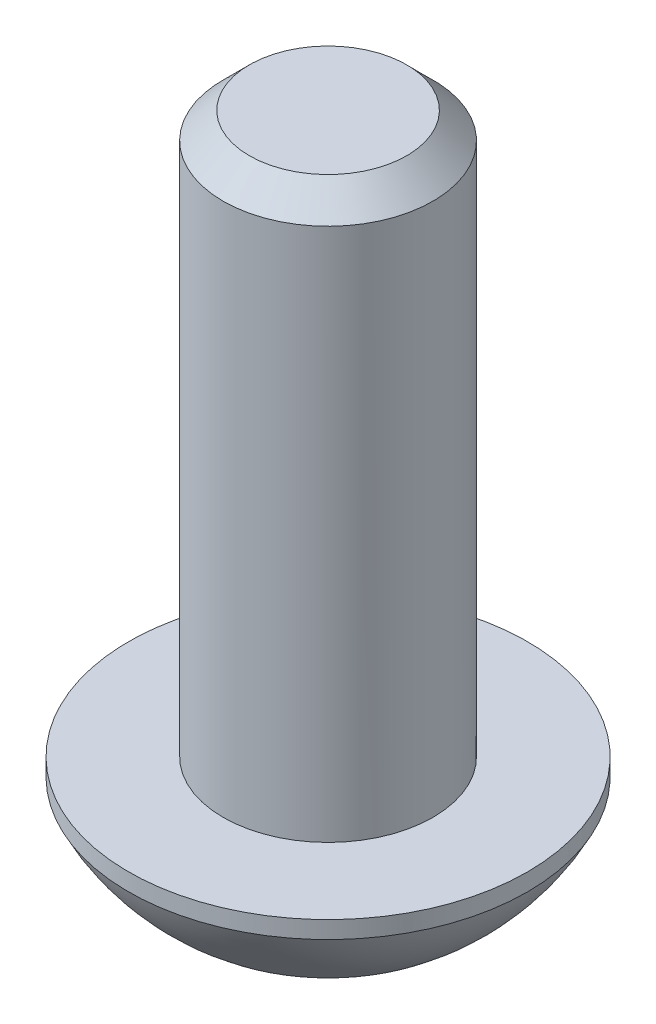
ISO-10303-21;
HEADER;
FILE_DESCRIPTION(('STEP AP214'),'2;1');
FILE_NAME('part.step','',(''),(''),'','','');
FILE_SCHEMA(('AUTOMOTIVE_DESIGN { 1 0 10303 214 1 1 1 1 }'));
ENDSEC;
DATA;
#1=APPLICATION_CONTEXT('core data for automotive mechanical design processes');
#2=APPLICATION_PROTOCOL_DEFINITION('international standard','automotive_design',2000,#1);
#3=PRODUCT_CONTEXT('',#1,'mechanical');
#4=PRODUCT('Part','Part','',(#3));
#5=PRODUCT_RELATED_PRODUCT_CATEGORY('part','',(#4));
#6=PRODUCT_DEFINITION_FORMATION('','',#4);
#7=PRODUCT_DEFINITION_CONTEXT('part definition',#1,'design');
#8=PRODUCT_DEFINITION('design','',#6,#7);
#9=PRODUCT_DEFINITION_SHAPE('','',#8);
#10=(LENGTH_UNIT() NAMED_UNIT(*) SI_UNIT(.MILLI.,.METRE.));
#11=(NAMED_UNIT(*) PLANE_ANGLE_UNIT() SI_UNIT($,.RADIAN.));
#12=(NAMED_UNIT(*) SI_UNIT($,.STERADIAN.) SOLID_ANGLE_UNIT());
#13=UNCERTAINTY_MEASURE_WITH_UNIT(LENGTH_MEASURE(1.E-05),#10,'distance_accuracy_value','');
#14=(GEOMETRIC_REPRESENTATION_CONTEXT(3) GLOBAL_UNCERTAINTY_ASSIGNED_CONTEXT((#13)) GLOBAL_UNIT_ASSIGNED_CONTEXT((#10,
#11,#12)) REPRESENTATION_CONTEXT('',''));
#15=CARTESIAN_POINT('',(0.,0.,0.));
#16=DIRECTION('',(0.,0.,1.));
#17=DIRECTION('',(1.,0.,0.));
#18=AXIS2_PLACEMENT_3D('',#15,#16,#17);
#19=CARTESIAN_POINT('',(12.5,31.750000124,0.));
#20=DIRECTION('',(0.,-1.,0.));
#21=DIRECTION('',(1.,0.,0.));
#22=AXIS2_PLACEMENT_3D('',#19,#20,#21);
#23=CONICAL_SURFACE('',#22,1.15470053837925,0.78539816339745);
#24=CARTESIAN_POINT('',(13.5,31.750000124,-0.577350269189623));
#25=CARTESIAN_POINT('',(13.5,31.9035249805768,-0.270300556036056));
#26=CARTESIAN_POINT('',(13.5,31.9046979425669,-0.00233230374689804));
#27=CARTESIAN_POINT('',(13.5,31.9058707863537,0.265608944482054));
#28=CARTESIAN_POINT('',(13.5,31.750000124,0.57735026918963));
#29=B_SPLINE_CURVE_WITH_KNOTS('',2,(#24,#25,#26,#27,#28),.UNSPECIFIED.,.F.,.F.,(3,2,3),(0.,0.5,
1.),.UNSPECIFIED.);
#30=CARTESIAN_POINT('',(13.5,31.750000124,-0.577350269189622));
#31=VERTEX_POINT('',#30);
#32=CARTESIAN_POINT('',(13.5,31.750000124,0.57735026918963));
#33=VERTEX_POINT('',#32);
#34=EDGE_CURVE('E379',#31,#33,#29,.T.);
#35=ORIENTED_EDGE('',*,*,#34,.F.);
#36=CARTESIAN_POINT('',(12.5,31.750000124,0.));
#37=DIRECTION('',(0.,-1.,0.));
#38=DIRECTION('',(1.,0.,0.));
#39=AXIS2_PLACEMENT_3D('',#36,#37,#38);
#40=CIRCLE('',#39,1.15470053837925);
#41=EDGE_CURVE('E281',#31,#33,#40,.T.);
#42=ORIENTED_EDGE('',*,*,#41,.T.);
#43=EDGE_LOOP('',(#35,#42));
#44=FACE_BOUND('',#43,.T.);
#45=ADVANCED_FACE('F16',(#44),#23,.F.);
#46=CARTESIAN_POINT('',(12.5,31.750000124,0.));
#47=DIRECTION('',(0.,-1.,0.));
#48=DIRECTION('',(1.,0.,0.));
#49=AXIS2_PLACEMENT_3D('',#46,#47,#48);
#50=CYLINDRICAL_SURFACE('',#49,2.85);
#51=CARTESIAN_POINT('',(12.5,33.400000124,0.));
#52=DIRECTION('',(0.,-1.,0.));
#53=DIRECTION('',(1.,0.,0.));
#54=AXIS2_PLACEMENT_3D('',#51,#52,#53);
#55=CIRCLE('',#54,2.85);
#56=CARTESIAN_POINT('',(15.35,33.400000124,0.));
#57=VERTEX_POINT('',#56);
#58=EDGE_CURVE('E305',#57,#57,#55,.T.);
#59=ORIENTED_EDGE('',*,*,#58,.T.);
#60=EDGE_LOOP('',(#59));
#61=FACE_BOUND('',#60,.T.);
#62=CARTESIAN_POINT('',(12.5,33.152500124,0.));
#63=DIRECTION('',(0.,-1.,0.));
#64=DIRECTION('',(1.,0.,0.));
#65=AXIS2_PLACEMENT_3D('',#62,#63,#64);
#66=CIRCLE('',#65,2.85);
#67=CARTESIAN_POINT('',(15.35,33.152500124,0.));
#68=VERTEX_POINT('',#67);
#69=EDGE_CURVE('E11',#68,#68,#66,.T.);
#70=ORIENTED_EDGE('',*,*,#69,.F.);
#71=EDGE_LOOP('',(#70));
#72=FACE_BOUND('',#71,.T.);
#73=ADVANCED_FACE('F18',(#61,#72),#50,.T.);
#74=CARTESIAN_POINT('',(12.5,34.5448330117005,0.));
#75=DIRECTION('',(1.,0.,0.));
#76=DIRECTION('',(0.,0.,-1.));
#77=AXIS2_PLACEMENT_3D('',#74,#75,#76);
#78=SPHERICAL_SURFACE('',#77,3.17192226735973);
#79=CARTESIAN_POINT('',(12.5,34.5448330117005,0.));
#80=DIRECTION('',(0.,-1.,0.));
#81=DIRECTION('',(1.,0.,0.));
#82=AXIS2_PLACEMENT_3D('',#79,#80,#81);
#83=SPHERICAL_SURFACE('',#82,3.17192226735973);
#84=ORIENTED_EDGE('',*,*,#69,.T.);
#85=EDGE_LOOP('',(#84));
#86=FACE_BOUND('',#85,.T.);
#87=CARTESIAN_POINT('',(12.5,31.750000124,0.));
#88=DIRECTION('',(0.,-1.,0.));
#89=DIRECTION('',(1.,0.,0.));
#90=AXIS2_PLACEMENT_3D('',#87,#88,#89);
#91=CIRCLE('',#90,1.5);
#92=CARTESIAN_POINT('',(14.,31.750000124,0.));
#93=VERTEX_POINT('',#92);
#94=EDGE_CURVE('E290',#93,#93,#91,.T.);
#95=ORIENTED_EDGE('',*,*,#94,.F.);
#96=EDGE_LOOP('',(#95));
#97=FACE_BOUND('',#96,.T.);
#98=ADVANCED_FACE('F353',(#86,#97),#83,.T.);
#99=CARTESIAN_POINT('',(12.5,41.400000124,0.));
#100=DIRECTION('',(0.,-1.,0.));
#101=DIRECTION('',(0.,0.,-1.));
#102=AXIS2_PLACEMENT_3D('',#99,#100,#101);
#103=CONICAL_SURFACE('',#102,1.125,0.785398163397446);
#104=CARTESIAN_POINT('',(12.5,41.400000124,0.));
#105=DIRECTION('',(0.,1.,0.));
#106=DIRECTION('',(0.,0.,1.));
#107=AXIS2_PLACEMENT_3D('',#104,#105,#106);
#108=CIRCLE('',#107,1.125);
#109=CARTESIAN_POINT('',(12.5,41.400000124,1.125));
#110=VERTEX_POINT('',#109);
#111=EDGE_CURVE('E289',#110,#110,#108,.T.);
#112=ORIENTED_EDGE('',*,*,#111,.F.);
#113=EDGE_LOOP('',(#112));
#114=FACE_BOUND('',#113,.T.);
#115=CARTESIAN_POINT('',(12.5,41.025000124,0.));
#116=DIRECTION('',(0.,-1.,0.));
#117=DIRECTION('',(0.,0.,1.));
#118=AXIS2_PLACEMENT_3D('',#115,#116,#117);
#119=CIRCLE('',#118,1.5);
#120=CARTESIAN_POINT('',(12.5,41.025000124,1.5));
#121=VERTEX_POINT('',#120);
#122=EDGE_CURVE('E28',#121,#121,#119,.T.);
#123=ORIENTED_EDGE('',*,*,#122,.F.);
#124=EDGE_LOOP('',(#123));
#125=FACE_BOUND('',#124,.T.);
#126=ADVANCED_FACE('F351',(#114,#125),#103,.T.);
#127=CARTESIAN_POINT('',(12.5,41.400000124,0.));
#128=DIRECTION('',(0.,1.,0.));
#129=DIRECTION('',(0.,0.,1.));
#130=AXIS2_PLACEMENT_3D('',#127,#128,#129);
#131=CYLINDRICAL_SURFACE('',#130,1.5);
#132=CARTESIAN_POINT('',(12.5,33.400000124,0.));
#133=DIRECTION('',(0.,1.,0.));
#134=DIRECTION('',(1.,0.,0.));
#135=AXIS2_PLACEMENT_3D('',#132,#133,#134);
#136=CIRCLE('',#135,1.5);
#137=CARTESIAN_POINT('',(14.,33.400000124,0.));
#138=VERTEX_POINT('',#137);
#139=EDGE_CURVE('E365',#138,#138,#136,.T.);
#140=ORIENTED_EDGE('',*,*,#139,.T.);
#141=EDGE_LOOP('',(#140));
#142=FACE_BOUND('',#141,.T.);
#143=ORIENTED_EDGE('',*,*,#122,.T.);
#144=EDGE_LOOP('',(#143));
#145=FACE_BOUND('',#144,.T.);
#146=ADVANCED_FACE('F228',(#142,#145),#131,.T.);
#147=CARTESIAN_POINT('',(12.5,41.400000124,-1.5));
#148=DIRECTION('',(0.,1.,0.));
#149=DIRECTION('',(0.,0.,-1.));
#150=AXIS2_PLACEMENT_3D('',#147,#148,#149);
#151=PLANE('',#150);
#152=ORIENTED_EDGE('',*,*,#111,.T.);
#153=EDGE_LOOP('',(#152));
#154=FACE_BOUND('',#153,.T.);
#155=ADVANCED_FACE('F272',(#154),#151,.T.);
#156=CARTESIAN_POINT('',(12.5,31.750000124,-1.5));
#157=DIRECTION('',(0.,1.,0.));
#158=DIRECTION('',(1.,0.,0.));
#159=AXIS2_PLACEMENT_3D('',#156,#157,#158);
#160=PLANE('',#159);
#161=CARTESIAN_POINT('',(12.5,31.750000124,0.));
#162=DIRECTION('',(0.,-1.,0.));
#163=DIRECTION('',(1.,0.,0.));
#164=AXIS2_PLACEMENT_3D('',#161,#162,#163);
#165=CIRCLE('',#164,1.15470053837925);
#166=CARTESIAN_POINT('',(11.5,31.750000124,0.57735026918963));
#167=VERTEX_POINT('',#166);
#168=CARTESIAN_POINT('',(11.5,31.750000124,-0.577350269189622));
#169=VERTEX_POINT('',#168);
#170=EDGE_CURVE('E201',#167,#169,#165,.T.);
#171=ORIENTED_EDGE('',*,*,#170,.F.);
#172=CARTESIAN_POINT('',(12.5,31.750000124,0.));
#173=DIRECTION('',(0.,-1.,0.));
#174=DIRECTION('',(1.,0.,0.));
#175=AXIS2_PLACEMENT_3D('',#172,#173,#174);
#176=CIRCLE('',#175,1.15470053837925);
#177=CARTESIAN_POINT('',(12.5,31.750000124,1.15470053837926));
#178=VERTEX_POINT('',#177);
#179=EDGE_CURVE('E244',#178,#167,#176,.T.);
#180=ORIENTED_EDGE('',*,*,#179,.F.);
#181=CARTESIAN_POINT('',(12.5,31.750000124,0.));
#182=DIRECTION('',(0.,-1.,0.));
#183=DIRECTION('',(1.,0.,0.));
#184=AXIS2_PLACEMENT_3D('',#181,#182,#183);
#185=CIRCLE('',#184,1.15470053837925);
#186=EDGE_CURVE('E302',#33,#178,#185,.T.);
#187=ORIENTED_EDGE('',*,*,#186,.F.);
#188=ORIENTED_EDGE('',*,*,#41,.F.);
#189=CARTESIAN_POINT('',(12.5,31.750000124,0.));
#190=DIRECTION('',(0.,-1.,0.));
#191=DIRECTION('',(1.,0.,0.));
#192=AXIS2_PLACEMENT_3D('',#189,#190,#191);
#193=CIRCLE('',#192,1.15470053837925);
#194=CARTESIAN_POINT('',(12.5,31.750000124,-1.15470053837925));
#195=VERTEX_POINT('',#194);
#196=EDGE_CURVE('E202',#195,#31,#193,.T.);
#197=ORIENTED_EDGE('',*,*,#196,.F.);
#198=CARTESIAN_POINT('',(12.5,31.750000124,0.));
#199=DIRECTION('',(0.,-1.,0.));
#200=DIRECTION('',(1.,0.,0.));
#201=AXIS2_PLACEMENT_3D('',#198,#199,#200);
#202=CIRCLE('',#201,1.15470053837925);
#203=EDGE_CURVE('E186',#169,#195,#202,.T.);
#204=ORIENTED_EDGE('',*,*,#203,.F.);
#205=EDGE_LOOP('',(#171,#180,#187,#188,#197,#204));
#206=FACE_BOUND('',#205,.T.);
#207=ORIENTED_EDGE('',*,*,#94,.T.);
#208=EDGE_LOOP('',(#207));
#209=FACE_BOUND('',#208,.T.);
#210=ADVANCED_FACE('F346',(#206,#209),#160,.F.);
#211=CARTESIAN_POINT('',(12.5,33.400000124,-2.85));
#212=DIRECTION('',(0.,-1.,0.));
#213=DIRECTION('',(0.,0.,-1.));
#214=AXIS2_PLACEMENT_3D('',#211,#212,#213);
#215=PLANE('',#214);
#216=ORIENTED_EDGE('',*,*,#139,.F.);
#217=EDGE_LOOP('',(#216));
#218=FACE_BOUND('',#217,.T.);
#219=ORIENTED_EDGE('',*,*,#58,.F.);
#220=EDGE_LOOP('',(#219));
#221=FACE_BOUND('',#220,.T.);
#222=ADVANCED_FACE('F343',(#218,#221),#215,.F.);
#223=CARTESIAN_POINT('',(12.5,31.750000124,0.));
#224=DIRECTION('',(0.,-1.,0.));
#225=DIRECTION('',(1.,0.,0.));
#226=AXIS2_PLACEMENT_3D('',#223,#224,#225);
#227=CONICAL_SURFACE('',#226,1.15470053837925,0.78539816339745);
#228=ORIENTED_EDGE('',*,*,#186,.T.);
#229=CARTESIAN_POINT('',(13.5,31.750000124,0.57735026918963));
#230=CARTESIAN_POINT('',(13.234077729137,31.9035304186663,0.730880563855873));
#231=CARTESIAN_POINT('',(13.0018404062,31.9046984043185,0.864962844769466));
#232=CARTESIAN_POINT('',(12.769965138002,31.9058645690974,0.998836093281985));
#233=CARTESIAN_POINT('',(12.5,31.750000124,1.15470053837926));
#234=B_SPLINE_CURVE_WITH_KNOTS('',2,(#229,#230,#231,#232,#233),.UNSPECIFIED.,.F.,.F.,(3,2,3),
(0.,0.5,1.),.UNSPECIFIED.);
#235=EDGE_CURVE('E312',#33,#178,#234,.T.);
#236=ORIENTED_EDGE('',*,*,#235,.F.);
#237=EDGE_LOOP('',(#228,#236));
#238=FACE_BOUND('',#237,.T.);
#239=ADVANCED_FACE('F226',(#238),#227,.F.);
#240=CARTESIAN_POINT('',(12.5,31.750000124,0.));
#241=DIRECTION('',(0.,-1.,0.));
#242=DIRECTION('',(1.,0.,0.));
#243=AXIS2_PLACEMENT_3D('',#240,#241,#242);
#244=CONICAL_SURFACE('',#243,1.15470053837925,0.78539816339745);
#245=ORIENTED_EDGE('',*,*,#179,.T.);
#246=CARTESIAN_POINT('',(12.5,31.750000124,1.15470053837926));
#247=CARTESIAN_POINT('',(12.2340777291371,31.9035304186663,1.00117024371303));
#248=CARTESIAN_POINT('',(12.0018404062,31.9046984043185,0.867087962799423));
#249=CARTESIAN_POINT('',(11.7699651380023,31.9058645690974,0.73321471428705));
#250=CARTESIAN_POINT('',(11.5,31.750000124,0.577350269189633));
#251=B_SPLINE_CURVE_WITH_KNOTS('',2,(#246,#247,#248,#249,#250),.UNSPECIFIED.,.F.,.F.,(3,2,3),
(0.,0.5,1.),.UNSPECIFIED.);
#252=EDGE_CURVE('E403',#178,#167,#251,.T.);
#253=ORIENTED_EDGE('',*,*,#252,.F.);
#254=EDGE_LOOP('',(#245,#253));
#255=FACE_BOUND('',#254,.T.);
#256=ADVANCED_FACE('F218',(#255),#244,.F.);
#257=CARTESIAN_POINT('',(12.5,31.750000124,0.));
#258=DIRECTION('',(0.,-1.,0.));
#259=DIRECTION('',(1.,0.,0.));
#260=AXIS2_PLACEMENT_3D('',#257,#258,#259);
#261=CONICAL_SURFACE('',#260,1.15470053837925,0.78539816339745);
#262=ORIENTED_EDGE('',*,*,#170,.T.);
#263=CARTESIAN_POINT('',(11.5,31.750000124,0.57735026918963));
#264=CARTESIAN_POINT('',(11.5,31.9035304186663,0.270289679857131));
#265=CARTESIAN_POINT('',(11.5,31.9046984043185,0.00212511802996607));
#266=CARTESIAN_POINT('',(11.5,31.9058645690974,-0.265621378994729));
#267=CARTESIAN_POINT('',(11.5,31.750000124,-0.577350269189622));
#268=B_SPLINE_CURVE_WITH_KNOTS('',2,(#263,#264,#265,#266,#267),.UNSPECIFIED.,.F.,.F.,(3,2,3),
(0.,0.5,1.),.UNSPECIFIED.);
#269=EDGE_CURVE('E250',#167,#169,#268,.T.);
#270=ORIENTED_EDGE('',*,*,#269,.F.);
#271=EDGE_LOOP('',(#262,#270));
#272=FACE_BOUND('',#271,.T.);
#273=ADVANCED_FACE('F209',(#272),#261,.F.);
#274=CARTESIAN_POINT('',(12.5,31.750000124,0.));
#275=DIRECTION('',(0.,-1.,0.));
#276=DIRECTION('',(1.,0.,0.));
#277=AXIS2_PLACEMENT_3D('',#274,#275,#276);
#278=CONICAL_SURFACE('',#277,1.15470053837925,0.78539816339745);
#279=ORIENTED_EDGE('',*,*,#203,.T.);
#280=CARTESIAN_POINT('',(11.5,31.750000124,-0.577350269189622));
#281=CARTESIAN_POINT('',(11.765922270863,31.9035304186663,-0.730880563855866));
#282=CARTESIAN_POINT('',(11.9981595938,31.9046984043185,-0.86496284476946));
#283=CARTESIAN_POINT('',(12.230034861998,31.9058645690974,-0.998836093281976));
#284=CARTESIAN_POINT('',(12.5,31.750000124,-1.15470053837925));
#285=B_SPLINE_CURVE_WITH_KNOTS('',2,(#280,#281,#282,#283,#284),.UNSPECIFIED.,.F.,.F.,(3,2,3),
(0.,0.5,1.),.UNSPECIFIED.);
#286=EDGE_CURVE('E124',#169,#195,#285,.T.);
#287=ORIENTED_EDGE('',*,*,#286,.F.);
#288=EDGE_LOOP('',(#279,#287));
#289=FACE_BOUND('',#288,.T.);
#290=ADVANCED_FACE('F184',(#289),#278,.F.);
#291=CARTESIAN_POINT('',(12.5,31.750000124,0.));
#292=DIRECTION('',(0.,-1.,0.));
#293=DIRECTION('',(1.,0.,0.));
#294=AXIS2_PLACEMENT_3D('',#291,#292,#293);
#295=CONICAL_SURFACE('',#294,1.15470053837925,0.78539816339745);
#296=ORIENTED_EDGE('',*,*,#196,.T.);
#297=CARTESIAN_POINT('',(12.5,31.750000124,-1.15470053837925));
#298=CARTESIAN_POINT('',(12.765922270863,31.9035304186663,-1.001170243713));
#299=CARTESIAN_POINT('',(12.9981595938,31.9046984043185,-0.867087962799411));
#300=CARTESIAN_POINT('',(13.230034861998,31.9058645690974,-0.733214714286895));
#301=CARTESIAN_POINT('',(13.5,31.750000124,-0.577350269189624));
#302=B_SPLINE_CURVE_WITH_KNOTS('',2,(#297,#298,#299,#300,#301),.UNSPECIFIED.,.F.,.F.,(3,2,3),
(0.,0.5,1.),.UNSPECIFIED.);
#303=EDGE_CURVE('E142',#195,#31,#302,.T.);
#304=ORIENTED_EDGE('',*,*,#303,.F.);
#305=EDGE_LOOP('',(#296,#304));
#306=FACE_BOUND('',#305,.T.);
#307=ADVANCED_FACE('F220',(#306),#295,.F.);
#308=CARTESIAN_POINT('',(13.5,32.905000124,-0.577350269189622));
#309=DIRECTION('',(0.,-1.,0.));
#310=DIRECTION('',(0.,0.,-1.));
#311=AXIS2_PLACEMENT_3D('',#308,#309,#310);
#312=PLANE('',#311);
#313=DIRECTION('',(0.866025403784439,0.,0.5));
#314=VECTOR('',#313,1.);
#315=CARTESIAN_POINT('',(12.5,32.905000124,-1.15470053837925));
#316=LINE('',#315,#314);
#317=CARTESIAN_POINT('',(12.5,32.905000124,-1.15470053837925));
#318=VERTEX_POINT('',#317);
#319=CARTESIAN_POINT('',(13.5,32.905000124,-0.577350269189622));
#320=VERTEX_POINT('',#319);
#321=EDGE_CURVE('E114',#318,#320,#316,.T.);
#322=ORIENTED_EDGE('',*,*,#321,.T.);
#323=DIRECTION('',(0.,0.,1.));
#324=VECTOR('',#323,1.);
#325=CARTESIAN_POINT('',(13.5,32.905000124,-0.577350269189622));
#326=LINE('',#325,#324);
#327=CARTESIAN_POINT('',(13.5,32.905000124,0.57735026918963));
#328=VERTEX_POINT('',#327);
#329=EDGE_CURVE('E296',#320,#328,#326,.T.);
#330=ORIENTED_EDGE('',*,*,#329,.T.);
#331=DIRECTION('',(-0.866025403784439,0.,0.5));
#332=VECTOR('',#331,1.);
#333=CARTESIAN_POINT('',(13.5,32.905000124,0.57735026918963));
#334=LINE('',#333,#332);
#335=CARTESIAN_POINT('',(12.5,32.905000124,1.15470053837926));
#336=VERTEX_POINT('',#335);
#337=EDGE_CURVE('E388',#328,#336,#334,.T.);
#338=ORIENTED_EDGE('',*,*,#337,.T.);
#339=DIRECTION('',(-0.866025403784439,0.,-0.5));
#340=VECTOR('',#339,1.);
#341=CARTESIAN_POINT('',(12.5,32.905000124,1.15470053837926));
#342=LINE('',#341,#340);
#343=CARTESIAN_POINT('',(11.5,32.905000124,0.57735026918963));
#344=VERTEX_POINT('',#343);
#345=EDGE_CURVE('E313',#336,#344,#342,.T.);
#346=ORIENTED_EDGE('',*,*,#345,.T.);
#347=DIRECTION('',(0.,0.,-1.));
#348=VECTOR('',#347,1.);
#349=CARTESIAN_POINT('',(11.5,32.905000124,0.57735026918963));
#350=LINE('',#349,#348);
#351=CARTESIAN_POINT('',(11.5,32.905000124,-0.577350269189622));
#352=VERTEX_POINT('',#351);
#353=EDGE_CURVE('E117',#344,#352,#350,.T.);
#354=ORIENTED_EDGE('',*,*,#353,.T.);
#355=DIRECTION('',(0.866025403784439,0.,-0.5));
#356=VECTOR('',#355,1.);
#357=CARTESIAN_POINT('',(11.5,32.905000124,-0.577350269189622));
#358=LINE('',#357,#356);
#359=EDGE_CURVE('E111',#352,#318,#358,.T.);
#360=ORIENTED_EDGE('',*,*,#359,.T.);
#361=EDGE_LOOP('',(#322,#330,#338,#346,#354,#360));
#362=FACE_BOUND('',#361,.T.);
#363=ADVANCED_FACE('F113',(#362),#312,.T.);
#364=CARTESIAN_POINT('',(13.5,32.905000124,-0.577350269189622));
#365=DIRECTION('',(1.,0.,0.));
#366=DIRECTION('',(0.,1.,0.));
#367=AXIS2_PLACEMENT_3D('',#364,#365,#366);
#368=PLANE('',#367);
#369=DIRECTION('',(0.,-1.,0.));
#370=VECTOR('',#369,1.);
#371=CARTESIAN_POINT('',(13.5,32.905000124,-0.577350269189622));
#372=LINE('',#371,#370);
#373=EDGE_CURVE('E132',#320,#31,#372,.T.);
#374=ORIENTED_EDGE('',*,*,#373,.T.);
#375=ORIENTED_EDGE('',*,*,#34,.T.);
#376=DIRECTION('',(0.,-1.,0.));
#377=VECTOR('',#376,1.);
#378=CARTESIAN_POINT('',(13.5,32.905000124,0.57735026918963));
#379=LINE('',#378,#377);
#380=EDGE_CURVE('E308',#328,#33,#379,.T.);
#381=ORIENTED_EDGE('',*,*,#380,.F.);
#382=ORIENTED_EDGE('',*,*,#329,.F.);
#383=EDGE_LOOP('',(#374,#375,#381,#382));
#384=FACE_BOUND('',#383,.T.);
#385=ADVANCED_FACE('F172',(#384),#368,.F.);
#386=CARTESIAN_POINT('',(13.5,32.905000124,0.57735026918963));
#387=DIRECTION('',(0.5,0.,0.866025403784439));
#388=DIRECTION('',(0.,-1.,0.));
#389=AXIS2_PLACEMENT_3D('',#386,#387,#388);
#390=PLANE('',#389);
#391=ORIENTED_EDGE('',*,*,#380,.T.);
#392=ORIENTED_EDGE('',*,*,#235,.T.);
#393=DIRECTION('',(0.,-1.,0.));
#394=VECTOR('',#393,1.);
#395=CARTESIAN_POINT('',(12.5,32.905000124,1.15470053837926));
#396=LINE('',#395,#394);
#397=EDGE_CURVE('E401',#336,#178,#396,.T.);
#398=ORIENTED_EDGE('',*,*,#397,.F.);
#399=ORIENTED_EDGE('',*,*,#337,.F.);
#400=EDGE_LOOP('',(#391,#392,#398,#399));
#401=FACE_BOUND('',#400,.T.);
#402=ADVANCED_FACE('F266',(#401),#390,.F.);
#403=CARTESIAN_POINT('',(12.5,32.905000124,1.15470053837926));
#404=DIRECTION('',(-0.5,0.,0.866025403784439));
#405=DIRECTION('',(0.,1.,0.));
#406=AXIS2_PLACEMENT_3D('',#403,#404,#405);
#407=PLANE('',#406);
#408=ORIENTED_EDGE('',*,*,#397,.T.);
#409=ORIENTED_EDGE('',*,*,#252,.T.);
#410=DIRECTION('',(0.,-1.,0.));
#411=VECTOR('',#410,1.);
#412=CARTESIAN_POINT('',(11.5,32.905000124,0.57735026918963));
#413=LINE('',#412,#411);
#414=EDGE_CURVE('E123',#344,#167,#413,.T.);
#415=ORIENTED_EDGE('',*,*,#414,.F.);
#416=ORIENTED_EDGE('',*,*,#345,.F.);
#417=EDGE_LOOP('',(#408,#409,#415,#416));
#418=FACE_BOUND('',#417,.T.);
#419=ADVANCED_FACE('F265',(#418),#407,.F.);
#420=CARTESIAN_POINT('',(11.5,32.905000124,0.57735026918963));
#421=DIRECTION('',(-1.,0.,0.));
#422=DIRECTION('',(0.,0.,1.));
#423=AXIS2_PLACEMENT_3D('',#420,#421,#422);
#424=PLANE('',#423);
#425=ORIENTED_EDGE('',*,*,#414,.T.);
#426=ORIENTED_EDGE('',*,*,#269,.T.);
#427=DIRECTION('',(0.,-1.,0.));
#428=VECTOR('',#427,1.);
#429=CARTESIAN_POINT('',(11.5,32.905000124,-0.577350269189622));
#430=LINE('',#429,#428);
#431=EDGE_CURVE('E134',#352,#169,#430,.T.);
#432=ORIENTED_EDGE('',*,*,#431,.F.);
#433=ORIENTED_EDGE('',*,*,#353,.F.);
#434=EDGE_LOOP('',(#425,#426,#432,#433));
#435=FACE_BOUND('',#434,.T.);
#436=ADVANCED_FACE('F171',(#435),#424,.F.);
#437=CARTESIAN_POINT('',(11.5,32.905000124,-0.577350269189622));
#438=DIRECTION('',(-0.5,0.,-0.866025403784439));
#439=DIRECTION('',(-0.866025403784439,0.,0.5));
#440=AXIS2_PLACEMENT_3D('',#437,#438,#439);
#441=PLANE('',#440);
#442=ORIENTED_EDGE('',*,*,#431,.T.);
#443=ORIENTED_EDGE('',*,*,#286,.T.);
#444=DIRECTION('',(0.,-1.,0.));
#445=VECTOR('',#444,1.);
#446=CARTESIAN_POINT('',(12.5,32.905000124,-1.15470053837925));
#447=LINE('',#446,#445);
#448=EDGE_CURVE('E130',#318,#195,#447,.T.);
#449=ORIENTED_EDGE('',*,*,#448,.F.);
#450=ORIENTED_EDGE('',*,*,#359,.F.);
#451=EDGE_LOOP('',(#442,#443,#449,#450));
#452=FACE_BOUND('',#451,.T.);
#453=ADVANCED_FACE('F137',(#452),#441,.F.);
#454=CARTESIAN_POINT('',(12.5,32.905000124,-1.15470053837925));
#455=DIRECTION('',(0.5,0.,-0.866025403784439));
#456=DIRECTION('',(0.,-1.,0.));
#457=AXIS2_PLACEMENT_3D('',#454,#455,#456);
#458=PLANE('',#457);
#459=ORIENTED_EDGE('',*,*,#448,.T.);
#460=ORIENTED_EDGE('',*,*,#303,.T.);
#461=ORIENTED_EDGE('',*,*,#373,.F.);
#462=ORIENTED_EDGE('',*,*,#321,.F.);
#463=EDGE_LOOP('',(#459,#460,#461,#462));
#464=FACE_BOUND('',#463,.T.);
#465=ADVANCED_FACE('F128',(#464),#458,.F.);
#466=CLOSED_SHELL('',(#45,#73,#98,#126,#146,#155,#210,#222,#239,#256,#273,#290,#307,#363,#385,
#402,#419,#436,#453,#465));
#467=MANIFOLD_SOLID_BREP('B1',#466);
#468=ADVANCED_BREP_SHAPE_REPRESENTATION('',(#18,#467),#14);
#469=SHAPE_DEFINITION_REPRESENTATION(#9,#468);
ENDSEC;
END-ISO-10303-21;
